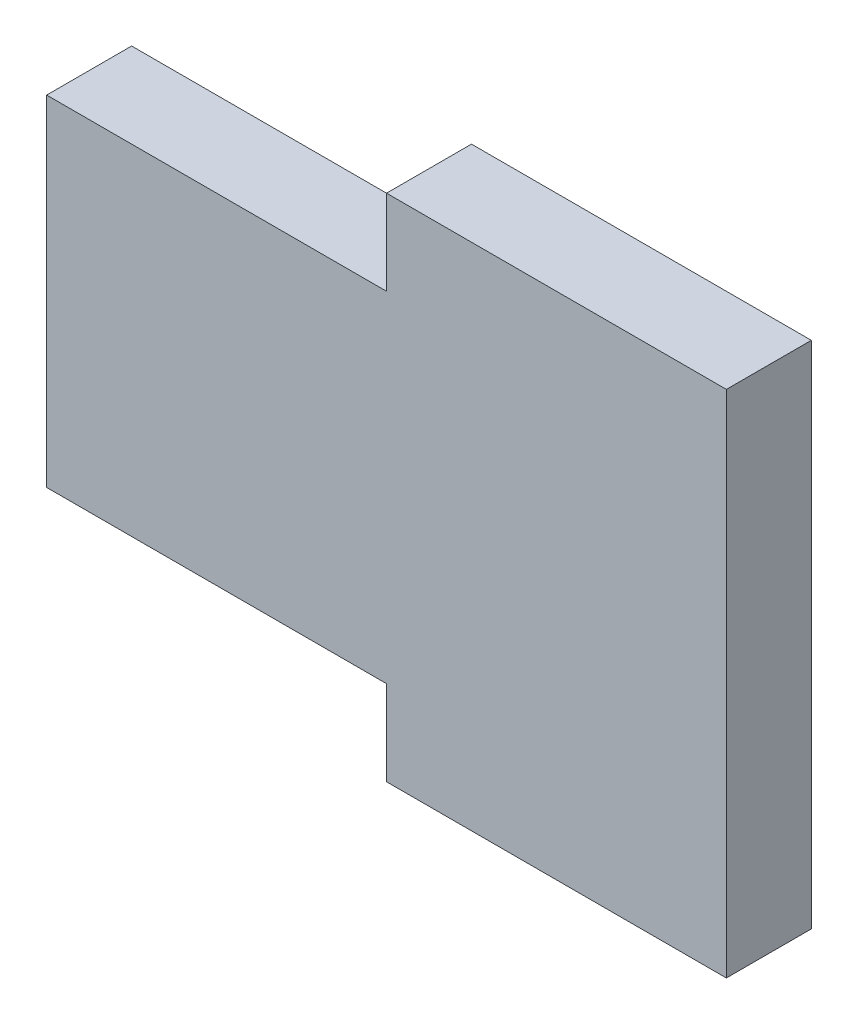
ISO-10303-21;
HEADER;
FILE_DESCRIPTION(('STEP AP214'),'2;1');
FILE_NAME('part.step','',(''),(''),'','','');
FILE_SCHEMA(('AUTOMOTIVE_DESIGN { 1 0 10303 214 1 1 1 1 }'));
ENDSEC;
DATA;
#1=APPLICATION_CONTEXT('core data for automotive mechanical design processes');
#2=APPLICATION_PROTOCOL_DEFINITION('international standard','automotive_design',2000,#1);
#3=PRODUCT_CONTEXT('',#1,'mechanical');
#4=PRODUCT('Part','Part','',(#3));
#5=PRODUCT_RELATED_PRODUCT_CATEGORY('part','',(#4));
#6=PRODUCT_DEFINITION_FORMATION('','',#4);
#7=PRODUCT_DEFINITION_CONTEXT('part definition',#1,'design');
#8=PRODUCT_DEFINITION('design','',#6,#7);
#9=PRODUCT_DEFINITION_SHAPE('','',#8);
#10=(LENGTH_UNIT() NAMED_UNIT(*) SI_UNIT(.MILLI.,.METRE.));
#11=(NAMED_UNIT(*) PLANE_ANGLE_UNIT() SI_UNIT($,.RADIAN.));
#12=(NAMED_UNIT(*) SI_UNIT($,.STERADIAN.) SOLID_ANGLE_UNIT());
#13=UNCERTAINTY_MEASURE_WITH_UNIT(LENGTH_MEASURE(1.E-05),#10,'distance_accuracy_value','');
#14=(GEOMETRIC_REPRESENTATION_CONTEXT(3) GLOBAL_UNCERTAINTY_ASSIGNED_CONTEXT((#13)) GLOBAL_UNIT_ASSIGNED_CONTEXT((#10,
#11,#12)) REPRESENTATION_CONTEXT('',''));
#15=CARTESIAN_POINT('',(0.,0.,0.));
#16=DIRECTION('',(0.,0.,1.));
#17=DIRECTION('',(1.,0.,0.));
#18=AXIS2_PLACEMENT_3D('',#15,#16,#17);
#19=CARTESIAN_POINT('',(288.925,0.,3.175));
#20=DIRECTION('',(0.,-1.,0.));
#21=DIRECTION('',(0.,0.,-1.));
#22=AXIS2_PLACEMENT_3D('',#19,#20,#21);
#23=PLANE('',#22);
#24=DIRECTION('',(-1.,0.,0.));
#25=VECTOR('',#24,1.);
#26=CARTESIAN_POINT('',(288.925,0.,0.));
#27=LINE('',#26,#25);
#28=CARTESIAN_POINT('',(288.925,0.,0.));
#29=VERTEX_POINT('',#28);
#30=CARTESIAN_POINT('',(276.225,0.,0.));
#31=VERTEX_POINT('',#30);
#32=EDGE_CURVE('E129',#29,#31,#27,.T.);
#33=ORIENTED_EDGE('',*,*,#32,.T.);
#34=DIRECTION('',(0.,0.,-1.));
#35=VECTOR('',#34,1.);
#36=CARTESIAN_POINT('',(276.225,0.,3.175));
#37=LINE('',#36,#35);
#38=CARTESIAN_POINT('',(276.225,0.,3.175));
#39=VERTEX_POINT('',#38);
#40=EDGE_CURVE('E11',#39,#31,#37,.T.);
#41=ORIENTED_EDGE('',*,*,#40,.F.);
#42=DIRECTION('',(-1.,0.,0.));
#43=VECTOR('',#42,1.);
#44=CARTESIAN_POINT('',(288.925,0.,3.175));
#45=LINE('',#44,#43);
#46=CARTESIAN_POINT('',(288.925,0.,3.175));
#47=VERTEX_POINT('',#46);
#48=EDGE_CURVE('E148',#47,#39,#45,.T.);
#49=ORIENTED_EDGE('',*,*,#48,.F.);
#50=DIRECTION('',(0.,0.,-1.));
#51=VECTOR('',#50,1.);
#52=CARTESIAN_POINT('',(288.925,0.,3.175));
#53=LINE('',#52,#51);
#54=EDGE_CURVE('E49',#47,#29,#53,.T.);
#55=ORIENTED_EDGE('',*,*,#54,.T.);
#56=EDGE_LOOP('',(#33,#41,#49,#55));
#57=FACE_BOUND('',#56,.T.);
#58=ADVANCED_FACE('F33',(#57),#23,.F.);
#59=CARTESIAN_POINT('',(276.225,0.,3.175));
#60=DIRECTION('',(1.,0.,0.));
#61=DIRECTION('',(0.,0.,-1.));
#62=AXIS2_PLACEMENT_3D('',#59,#60,#61);
#63=PLANE('',#62);
#64=DIRECTION('',(0.,-1.,0.));
#65=VECTOR('',#64,1.);
#66=CARTESIAN_POINT('',(276.225,0.,0.));
#67=LINE('',#66,#65);
#68=CARTESIAN_POINT('',(276.225,-3.175,0.));
#69=VERTEX_POINT('',#68);
#70=EDGE_CURVE('E131',#31,#69,#67,.T.);
#71=ORIENTED_EDGE('',*,*,#70,.T.);
#72=DIRECTION('',(0.,0.,-1.));
#73=VECTOR('',#72,1.);
#74=CARTESIAN_POINT('',(276.225,-3.175,3.175));
#75=LINE('',#74,#73);
#76=CARTESIAN_POINT('',(276.225,-3.175,3.175));
#77=VERTEX_POINT('',#76);
#78=EDGE_CURVE('E41',#77,#69,#75,.T.);
#79=ORIENTED_EDGE('',*,*,#78,.F.);
#80=DIRECTION('',(0.,-1.,0.));
#81=VECTOR('',#80,1.);
#82=CARTESIAN_POINT('',(276.225,0.,3.175));
#83=LINE('',#82,#81);
#84=EDGE_CURVE('E87',#39,#77,#83,.T.);
#85=ORIENTED_EDGE('',*,*,#84,.F.);
#86=ORIENTED_EDGE('',*,*,#40,.T.);
#87=EDGE_LOOP('',(#71,#79,#85,#86));
#88=FACE_BOUND('',#87,.T.);
#89=ADVANCED_FACE('F162',(#88),#63,.F.);
#90=CARTESIAN_POINT('',(263.525,-3.175,3.175));
#91=DIRECTION('',(0.,1.,0.));
#92=DIRECTION('',(0.,0.,1.));
#93=AXIS2_PLACEMENT_3D('',#90,#91,#92);
#94=PLANE('',#93);
#95=DIRECTION('',(1.,0.,0.));
#96=VECTOR('',#95,1.);
#97=CARTESIAN_POINT('',(263.525,-3.175,0.));
#98=LINE('',#97,#96);
#99=CARTESIAN_POINT('',(263.525,-3.175,0.));
#100=VERTEX_POINT('',#99);
#101=EDGE_CURVE('E134',#100,#69,#98,.T.);
#102=ORIENTED_EDGE('',*,*,#101,.F.);
#103=DIRECTION('',(0.,0.,-1.));
#104=VECTOR('',#103,1.);
#105=CARTESIAN_POINT('',(263.525,-3.175,3.175));
#106=LINE('',#105,#104);
#107=CARTESIAN_POINT('',(263.525,-3.175,3.175));
#108=VERTEX_POINT('',#107);
#109=EDGE_CURVE('E155',#108,#100,#106,.T.);
#110=ORIENTED_EDGE('',*,*,#109,.F.);
#111=DIRECTION('',(1.,0.,0.));
#112=VECTOR('',#111,1.);
#113=CARTESIAN_POINT('',(263.525,-3.175,3.175));
#114=LINE('',#113,#112);
#115=EDGE_CURVE('E161',#108,#77,#114,.T.);
#116=ORIENTED_EDGE('',*,*,#115,.T.);
#117=ORIENTED_EDGE('',*,*,#78,.T.);
#118=EDGE_LOOP('',(#102,#110,#116,#117));
#119=FACE_BOUND('',#118,.T.);
#120=ADVANCED_FACE('F159',(#119),#94,.T.);
#121=CARTESIAN_POINT('',(263.525,-3.175,3.175));
#122=DIRECTION('',(1.,0.,0.));
#123=DIRECTION('',(0.,0.,-1.));
#124=AXIS2_PLACEMENT_3D('',#121,#122,#123);
#125=PLANE('',#124);
#126=DIRECTION('',(0.,-1.,0.));
#127=VECTOR('',#126,1.);
#128=CARTESIAN_POINT('',(263.525,-3.175,0.));
#129=LINE('',#128,#127);
#130=CARTESIAN_POINT('',(263.525,-15.875,0.));
#131=VERTEX_POINT('',#130);
#132=EDGE_CURVE('E137',#100,#131,#129,.T.);
#133=ORIENTED_EDGE('',*,*,#132,.T.);
#134=DIRECTION('',(0.,0.,-1.));
#135=VECTOR('',#134,1.);
#136=CARTESIAN_POINT('',(263.525,-15.875,3.175));
#137=LINE('',#136,#135);
#138=CARTESIAN_POINT('',(263.525,-15.875,3.175));
#139=VERTEX_POINT('',#138);
#140=EDGE_CURVE('E152',#139,#131,#137,.T.);
#141=ORIENTED_EDGE('',*,*,#140,.F.);
#142=DIRECTION('',(0.,-1.,0.));
#143=VECTOR('',#142,1.);
#144=CARTESIAN_POINT('',(263.525,-3.175,3.175));
#145=LINE('',#144,#143);
#146=EDGE_CURVE('E174',#108,#139,#145,.T.);
#147=ORIENTED_EDGE('',*,*,#146,.F.);
#148=ORIENTED_EDGE('',*,*,#109,.T.);
#149=EDGE_LOOP('',(#133,#141,#147,#148));
#150=FACE_BOUND('',#149,.T.);
#151=ADVANCED_FACE('F170',(#150),#125,.F.);
#152=CARTESIAN_POINT('',(263.525,-15.875,3.175));
#153=DIRECTION('',(0.,1.,0.));
#154=DIRECTION('',(0.,0.,1.));
#155=AXIS2_PLACEMENT_3D('',#152,#153,#154);
#156=PLANE('',#155);
#157=DIRECTION('',(1.,0.,0.));
#158=VECTOR('',#157,1.);
#159=CARTESIAN_POINT('',(263.525,-15.875,0.));
#160=LINE('',#159,#158);
#161=CARTESIAN_POINT('',(276.225,-15.875,0.));
#162=VERTEX_POINT('',#161);
#163=EDGE_CURVE('E139',#131,#162,#160,.T.);
#164=ORIENTED_EDGE('',*,*,#163,.T.);
#165=DIRECTION('',(0.,0.,-1.));
#166=VECTOR('',#165,1.);
#167=CARTESIAN_POINT('',(276.225,-15.875,3.175));
#168=LINE('',#167,#166);
#169=CARTESIAN_POINT('',(276.225,-15.875,3.175));
#170=VERTEX_POINT('',#169);
#171=EDGE_CURVE('E112',#170,#162,#168,.T.);
#172=ORIENTED_EDGE('',*,*,#171,.F.);
#173=DIRECTION('',(1.,0.,0.));
#174=VECTOR('',#173,1.);
#175=CARTESIAN_POINT('',(263.525,-15.875,3.175));
#176=LINE('',#175,#174);
#177=EDGE_CURVE('E120',#139,#170,#176,.T.);
#178=ORIENTED_EDGE('',*,*,#177,.F.);
#179=ORIENTED_EDGE('',*,*,#140,.T.);
#180=EDGE_LOOP('',(#164,#172,#178,#179));
#181=FACE_BOUND('',#180,.T.);
#182=ADVANCED_FACE('F173',(#181),#156,.F.);
#183=CARTESIAN_POINT('',(276.225,-19.05,3.175));
#184=DIRECTION('',(-1.,0.,0.));
#185=DIRECTION('',(0.,0.,1.));
#186=AXIS2_PLACEMENT_3D('',#183,#184,#185);
#187=PLANE('',#186);
#188=DIRECTION('',(0.,1.,0.));
#189=VECTOR('',#188,1.);
#190=CARTESIAN_POINT('',(276.225,-19.05,0.));
#191=LINE('',#190,#189);
#192=CARTESIAN_POINT('',(276.225,-19.05,0.));
#193=VERTEX_POINT('',#192);
#194=EDGE_CURVE('E108',#193,#162,#191,.T.);
#195=ORIENTED_EDGE('',*,*,#194,.F.);
#196=DIRECTION('',(0.,0.,-1.));
#197=VECTOR('',#196,1.);
#198=CARTESIAN_POINT('',(276.225,-19.05,3.175));
#199=LINE('',#198,#197);
#200=CARTESIAN_POINT('',(276.225,-19.05,3.175));
#201=VERTEX_POINT('',#200);
#202=EDGE_CURVE('E103',#201,#193,#199,.T.);
#203=ORIENTED_EDGE('',*,*,#202,.F.);
#204=DIRECTION('',(0.,1.,0.));
#205=VECTOR('',#204,1.);
#206=CARTESIAN_POINT('',(276.225,-19.05,3.175));
#207=LINE('',#206,#205);
#208=EDGE_CURVE('E106',#201,#170,#207,.T.);
#209=ORIENTED_EDGE('',*,*,#208,.T.);
#210=ORIENTED_EDGE('',*,*,#171,.T.);
#211=EDGE_LOOP('',(#195,#203,#209,#210));
#212=FACE_BOUND('',#211,.T.);
#213=ADVANCED_FACE('F105',(#212),#187,.T.);
#214=CARTESIAN_POINT('',(288.925,-19.05,3.175));
#215=DIRECTION('',(0.,-1.,0.));
#216=DIRECTION('',(0.,0.,-1.));
#217=AXIS2_PLACEMENT_3D('',#214,#215,#216);
#218=PLANE('',#217);
#219=DIRECTION('',(-1.,0.,0.));
#220=VECTOR('',#219,1.);
#221=CARTESIAN_POINT('',(288.925,-19.05,0.));
#222=LINE('',#221,#220);
#223=CARTESIAN_POINT('',(288.925,-19.05,0.));
#224=VERTEX_POINT('',#223);
#225=EDGE_CURVE('E143',#224,#193,#222,.T.);
#226=ORIENTED_EDGE('',*,*,#225,.F.);
#227=DIRECTION('',(0.,0.,-1.));
#228=VECTOR('',#227,1.);
#229=CARTESIAN_POINT('',(288.925,-19.05,3.175));
#230=LINE('',#229,#228);
#231=CARTESIAN_POINT('',(288.925,-19.05,3.175));
#232=VERTEX_POINT('',#231);
#233=EDGE_CURVE('E75',#232,#224,#230,.T.);
#234=ORIENTED_EDGE('',*,*,#233,.F.);
#235=DIRECTION('',(-1.,0.,0.));
#236=VECTOR('',#235,1.);
#237=CARTESIAN_POINT('',(288.925,-19.05,3.175));
#238=LINE('',#237,#236);
#239=EDGE_CURVE('E118',#232,#201,#238,.T.);
#240=ORIENTED_EDGE('',*,*,#239,.T.);
#241=ORIENTED_EDGE('',*,*,#202,.T.);
#242=EDGE_LOOP('',(#226,#234,#240,#241));
#243=FACE_BOUND('',#242,.T.);
#244=ADVANCED_FACE('F123',(#243),#218,.T.);
#245=CARTESIAN_POINT('',(288.925,0.,3.175));
#246=DIRECTION('',(1.,0.,0.));
#247=DIRECTION('',(0.,0.,-1.));
#248=AXIS2_PLACEMENT_3D('',#245,#246,#247);
#249=PLANE('',#248);
#250=DIRECTION('',(0.,-1.,0.));
#251=VECTOR('',#250,1.);
#252=CARTESIAN_POINT('',(288.925,0.,0.));
#253=LINE('',#252,#251);
#254=EDGE_CURVE('E145',#29,#224,#253,.T.);
#255=ORIENTED_EDGE('',*,*,#254,.F.);
#256=ORIENTED_EDGE('',*,*,#54,.F.);
#257=DIRECTION('',(0.,-1.,0.));
#258=VECTOR('',#257,1.);
#259=CARTESIAN_POINT('',(288.925,0.,3.175));
#260=LINE('',#259,#258);
#261=EDGE_CURVE('E124',#47,#232,#260,.T.);
#262=ORIENTED_EDGE('',*,*,#261,.T.);
#263=ORIENTED_EDGE('',*,*,#233,.T.);
#264=EDGE_LOOP('',(#255,#256,#262,#263));
#265=FACE_BOUND('',#264,.T.);
#266=ADVANCED_FACE('F179',(#265),#249,.T.);
#267=CARTESIAN_POINT('',(0.,0.,3.175));
#268=DIRECTION('',(0.,0.,1.));
#269=DIRECTION('',(1.,0.,0.));
#270=AXIS2_PLACEMENT_3D('',#267,#268,#269);
#271=PLANE('',#270);
#272=ORIENTED_EDGE('',*,*,#48,.T.);
#273=ORIENTED_EDGE('',*,*,#84,.T.);
#274=ORIENTED_EDGE('',*,*,#115,.F.);
#275=ORIENTED_EDGE('',*,*,#146,.T.);
#276=ORIENTED_EDGE('',*,*,#177,.T.);
#277=ORIENTED_EDGE('',*,*,#208,.F.);
#278=ORIENTED_EDGE('',*,*,#239,.F.);
#279=ORIENTED_EDGE('',*,*,#261,.F.);
#280=EDGE_LOOP('',(#272,#273,#274,#275,#276,#277,#278,#279));
#281=FACE_BOUND('',#280,.T.);
#282=ADVANCED_FACE('F116',(#281),#271,.T.);
#283=CARTESIAN_POINT('',(0.,0.,0.));
#284=DIRECTION('',(0.,0.,1.));
#285=DIRECTION('',(1.,0.,0.));
#286=AXIS2_PLACEMENT_3D('',#283,#284,#285);
#287=PLANE('',#286);
#288=ORIENTED_EDGE('',*,*,#32,.F.);
#289=ORIENTED_EDGE('',*,*,#254,.T.);
#290=ORIENTED_EDGE('',*,*,#225,.T.);
#291=ORIENTED_EDGE('',*,*,#194,.T.);
#292=ORIENTED_EDGE('',*,*,#163,.F.);
#293=ORIENTED_EDGE('',*,*,#132,.F.);
#294=ORIENTED_EDGE('',*,*,#101,.T.);
#295=ORIENTED_EDGE('',*,*,#70,.F.);
#296=EDGE_LOOP('',(#288,#289,#290,#291,#292,#293,#294,#295));
#297=FACE_BOUND('',#296,.T.);
#298=ADVANCED_FACE('F166',(#297),#287,.F.);
#299=CLOSED_SHELL('',(#58,#89,#120,#151,#182,#213,#244,#266,#282,#298));
#300=MANIFOLD_SOLID_BREP('B2',#299);
#301=ADVANCED_BREP_SHAPE_REPRESENTATION('',(#18,#300),#14);
#302=SHAPE_DEFINITION_REPRESENTATION(#9,#301);
ENDSEC;
END-ISO-10303-21;
